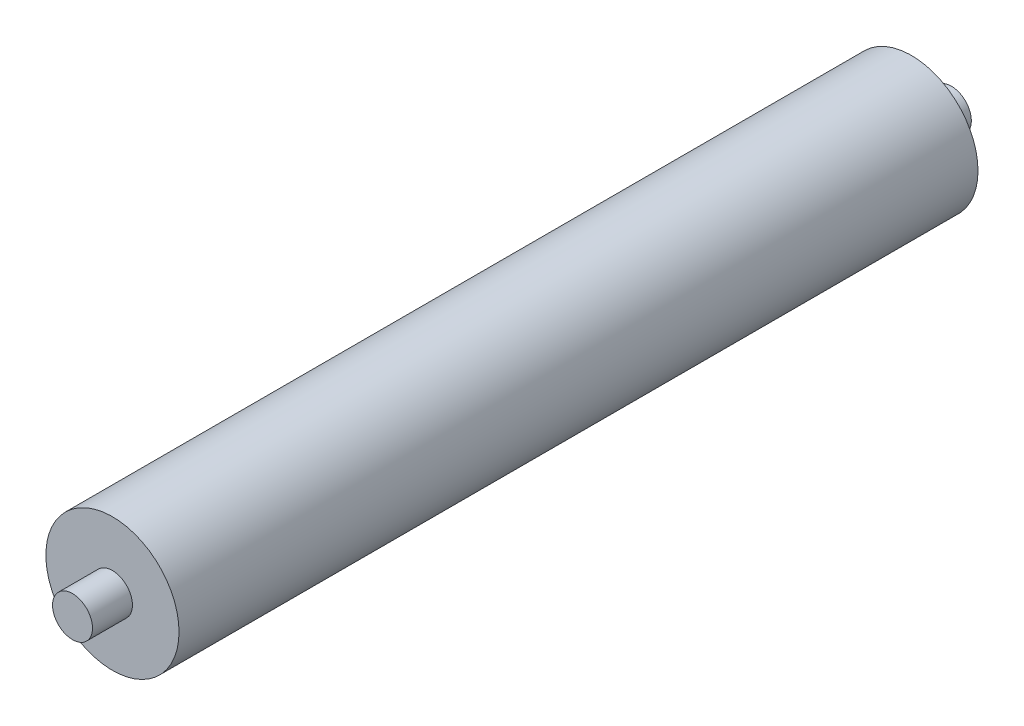
ISO-10303-21;
HEADER;
FILE_DESCRIPTION(('STEP AP214'),'2;1');
FILE_NAME('part.step','',(''),(''),'','','');
FILE_SCHEMA(('AUTOMOTIVE_DESIGN { 1 0 10303 214 1 1 1 1 }'));
ENDSEC;
DATA;
#1=APPLICATION_CONTEXT('core data for automotive mechanical design processes');
#2=APPLICATION_PROTOCOL_DEFINITION('international standard','automotive_design',2000,#1);
#3=PRODUCT_CONTEXT('',#1,'mechanical');
#4=PRODUCT('Part','Part','',(#3));
#5=PRODUCT_RELATED_PRODUCT_CATEGORY('part','',(#4));
#6=PRODUCT_DEFINITION_FORMATION('','',#4);
#7=PRODUCT_DEFINITION_CONTEXT('part definition',#1,'design');
#8=PRODUCT_DEFINITION('design','',#6,#7);
#9=PRODUCT_DEFINITION_SHAPE('','',#8);
#10=(LENGTH_UNIT() NAMED_UNIT(*) SI_UNIT(.MILLI.,.METRE.));
#11=(NAMED_UNIT(*) PLANE_ANGLE_UNIT() SI_UNIT($,.RADIAN.));
#12=(NAMED_UNIT(*) SI_UNIT($,.STERADIAN.) SOLID_ANGLE_UNIT());
#13=UNCERTAINTY_MEASURE_WITH_UNIT(LENGTH_MEASURE(1.E-05),#10,'distance_accuracy_value','');
#14=(GEOMETRIC_REPRESENTATION_CONTEXT(3) GLOBAL_UNCERTAINTY_ASSIGNED_CONTEXT((#13)) GLOBAL_UNIT_ASSIGNED_CONTEXT((#10,
#11,#12)) REPRESENTATION_CONTEXT('',''));
#15=CARTESIAN_POINT('',(0.,0.,0.));
#16=DIRECTION('',(0.,0.,1.));
#17=DIRECTION('',(1.,0.,0.));
#18=AXIS2_PLACEMENT_3D('',#15,#16,#17);
#19=CARTESIAN_POINT('',(0.,0.,150.));
#20=DIRECTION('',(0.,0.,-1.));
#21=DIRECTION('',(-1.,0.,0.));
#22=AXIS2_PLACEMENT_3D('',#19,#20,#21);
#23=CYLINDRICAL_SURFACE('',#22,25.);
#24=CARTESIAN_POINT('',(0.,0.,150.));
#25=DIRECTION('',(0.,0.,1.));
#26=DIRECTION('',(1.,0.,0.));
#27=AXIS2_PLACEMENT_3D('',#24,#25,#26);
#28=CIRCLE('',#27,25.);
#29=CARTESIAN_POINT('',(25.,0.,150.));
#30=VERTEX_POINT('',#29);
#31=EDGE_CURVE('E57',#30,#30,#28,.T.);
#32=ORIENTED_EDGE('',*,*,#31,.F.);
#33=EDGE_LOOP('',(#32));
#34=FACE_BOUND('',#33,.T.);
#35=CARTESIAN_POINT('',(0.,0.,-150.));
#36=DIRECTION('',(0.,0.,1.));
#37=DIRECTION('',(1.,0.,0.));
#38=AXIS2_PLACEMENT_3D('',#35,#36,#37);
#39=CIRCLE('',#38,25.);
#40=CARTESIAN_POINT('',(25.,0.,-150.));
#41=VERTEX_POINT('',#40);
#42=EDGE_CURVE('E60',#41,#41,#39,.T.);
#43=ORIENTED_EDGE('',*,*,#42,.T.);
#44=EDGE_LOOP('',(#43));
#45=FACE_BOUND('',#44,.T.);
#46=ADVANCED_FACE('F39',(#34,#45),#23,.T.);
#47=CARTESIAN_POINT('',(0.,0.,150.));
#48=DIRECTION('',(0.,0.,1.));
#49=DIRECTION('',(1.,0.,0.));
#50=AXIS2_PLACEMENT_3D('',#47,#48,#49);
#51=PLANE('',#50);
#52=CARTESIAN_POINT('',(0.,0.,150.));
#53=DIRECTION('',(0.,0.,1.));
#54=DIRECTION('',(1.,0.,0.));
#55=AXIS2_PLACEMENT_3D('',#52,#53,#54);
#56=CIRCLE('',#55,7.5);
#57=CARTESIAN_POINT('',(7.5,0.,150.));
#58=VERTEX_POINT('',#57);
#59=EDGE_CURVE('E10',#58,#58,#56,.T.);
#60=ORIENTED_EDGE('',*,*,#59,.F.);
#61=EDGE_LOOP('',(#60));
#62=FACE_BOUND('',#61,.T.);
#63=ORIENTED_EDGE('',*,*,#31,.T.);
#64=EDGE_LOOP('',(#63));
#65=FACE_BOUND('',#64,.T.);
#66=ADVANCED_FACE('F93',(#62,#65),#51,.T.);
#67=CARTESIAN_POINT('',(0.,0.,-150.));
#68=DIRECTION('',(0.,0.,1.));
#69=DIRECTION('',(1.,0.,0.));
#70=AXIS2_PLACEMENT_3D('',#67,#68,#69);
#71=PLANE('',#70);
#72=CARTESIAN_POINT('',(0.,0.,-150.));
#73=DIRECTION('',(0.,0.,1.));
#74=DIRECTION('',(1.,0.,0.));
#75=AXIS2_PLACEMENT_3D('',#72,#73,#74);
#76=CIRCLE('',#75,7.5);
#77=CARTESIAN_POINT('',(7.5,0.,-150.));
#78=VERTEX_POINT('',#77);
#79=EDGE_CURVE('E69',#78,#78,#76,.T.);
#80=ORIENTED_EDGE('',*,*,#79,.T.);
#81=EDGE_LOOP('',(#80));
#82=FACE_BOUND('',#81,.T.);
#83=ORIENTED_EDGE('',*,*,#42,.F.);
#84=EDGE_LOOP('',(#83));
#85=FACE_BOUND('',#84,.T.);
#86=ADVANCED_FACE('F76',(#82,#85),#71,.F.);
#87=CARTESIAN_POINT('',(0.,0.,165.));
#88=DIRECTION('',(0.,0.,-1.));
#89=DIRECTION('',(-1.,0.,0.));
#90=AXIS2_PLACEMENT_3D('',#87,#88,#89);
#91=CYLINDRICAL_SURFACE('',#90,7.5);
#92=CARTESIAN_POINT('',(0.,0.,165.));
#93=DIRECTION('',(0.,0.,1.));
#94=DIRECTION('',(1.,0.,0.));
#95=AXIS2_PLACEMENT_3D('',#92,#93,#94);
#96=CIRCLE('',#95,7.5);
#97=CARTESIAN_POINT('',(7.5,0.,165.));
#98=VERTEX_POINT('',#97);
#99=EDGE_CURVE('E55',#98,#98,#96,.T.);
#100=ORIENTED_EDGE('',*,*,#99,.F.);
#101=EDGE_LOOP('',(#100));
#102=FACE_BOUND('',#101,.T.);
#103=ORIENTED_EDGE('',*,*,#59,.T.);
#104=EDGE_LOOP('',(#103));
#105=FACE_BOUND('',#104,.T.);
#106=ADVANCED_FACE('F90',(#102,#105),#91,.T.);
#107=CARTESIAN_POINT('',(0.,0.,165.));
#108=DIRECTION('',(0.,0.,1.));
#109=DIRECTION('',(1.,0.,0.));
#110=AXIS2_PLACEMENT_3D('',#107,#108,#109);
#111=PLANE('',#110);
#112=ORIENTED_EDGE('',*,*,#99,.T.);
#113=EDGE_LOOP('',(#112));
#114=FACE_BOUND('',#113,.T.);
#115=ADVANCED_FACE('F82',(#114),#111,.T.);
#116=CARTESIAN_POINT('',(0.,0.,-165.));
#117=DIRECTION('',(0.,0.,1.));
#118=DIRECTION('',(1.,0.,0.));
#119=AXIS2_PLACEMENT_3D('',#116,#117,#118);
#120=CYLINDRICAL_SURFACE('',#119,7.5);
#121=CARTESIAN_POINT('',(0.,0.,-165.));
#122=DIRECTION('',(0.,0.,1.));
#123=DIRECTION('',(1.,0.,0.));
#124=AXIS2_PLACEMENT_3D('',#121,#122,#123);
#125=CIRCLE('',#124,7.5);
#126=CARTESIAN_POINT('',(7.5,0.,-165.));
#127=VERTEX_POINT('',#126);
#128=EDGE_CURVE('E65',#127,#127,#125,.T.);
#129=ORIENTED_EDGE('',*,*,#128,.T.);
#130=EDGE_LOOP('',(#129));
#131=FACE_BOUND('',#130,.T.);
#132=ORIENTED_EDGE('',*,*,#79,.F.);
#133=EDGE_LOOP('',(#132));
#134=FACE_BOUND('',#133,.T.);
#135=ADVANCED_FACE('F79',(#131,#134),#120,.T.);
#136=CARTESIAN_POINT('',(0.,0.,-165.));
#137=DIRECTION('',(0.,0.,-1.));
#138=DIRECTION('',(1.,0.,0.));
#139=AXIS2_PLACEMENT_3D('',#136,#137,#138);
#140=PLANE('',#139);
#141=ORIENTED_EDGE('',*,*,#128,.F.);
#142=EDGE_LOOP('',(#141));
#143=FACE_BOUND('',#142,.T.);
#144=ADVANCED_FACE('F81',(#143),#140,.T.);
#145=CLOSED_SHELL('',(#46,#66,#86,#106,#115,#135,#144));
#146=CARTESIAN_POINT('',(0.,0.,150.));
#147=DIRECTION('',(0.,0.,-1.));
#148=DIRECTION('',(-1.,0.,0.));
#149=AXIS2_PLACEMENT_3D('',#146,#147,#148);
#150=CYLINDRICAL_SURFACE('',#149,20.);
#151=CARTESIAN_POINT('',(0.,0.,145.));
#152=DIRECTION('',(0.,0.,1.));
#153=DIRECTION('',(1.,0.,0.));
#154=AXIS2_PLACEMENT_3D('',#151,#152,#153);
#155=CIRCLE('',#154,20.);
#156=CARTESIAN_POINT('',(20.,0.,145.));
#157=VERTEX_POINT('',#156);
#158=EDGE_CURVE('E48',#157,#157,#155,.T.);
#159=ORIENTED_EDGE('',*,*,#158,.T.);
#160=EDGE_LOOP('',(#159));
#161=FACE_BOUND('',#160,.T.);
#162=CARTESIAN_POINT('',(0.,0.,-145.));
#163=DIRECTION('',(0.,0.,1.));
#164=DIRECTION('',(1.,0.,0.));
#165=AXIS2_PLACEMENT_3D('',#162,#163,#164);
#166=CIRCLE('',#165,20.);
#167=CARTESIAN_POINT('',(20.,0.,-145.));
#168=VERTEX_POINT('',#167);
#169=EDGE_CURVE('E43',#168,#168,#166,.T.);
#170=ORIENTED_EDGE('',*,*,#169,.F.);
#171=EDGE_LOOP('',(#170));
#172=FACE_BOUND('',#171,.T.);
#173=ADVANCED_FACE('F104',(#161,#172),#150,.F.);
#174=CARTESIAN_POINT('',(0.,0.,145.));
#175=DIRECTION('',(0.,0.,1.));
#176=DIRECTION('',(1.,0.,0.));
#177=AXIS2_PLACEMENT_3D('',#174,#175,#176);
#178=PLANE('',#177);
#179=ORIENTED_EDGE('',*,*,#158,.F.);
#180=EDGE_LOOP('',(#179));
#181=FACE_BOUND('',#180,.T.);
#182=ADVANCED_FACE('F106',(#181),#178,.F.);
#183=CARTESIAN_POINT('',(0.,0.,-145.));
#184=DIRECTION('',(0.,0.,1.));
#185=DIRECTION('',(1.,0.,0.));
#186=AXIS2_PLACEMENT_3D('',#183,#184,#185);
#187=PLANE('',#186);
#188=ORIENTED_EDGE('',*,*,#169,.T.);
#189=EDGE_LOOP('',(#188));
#190=FACE_BOUND('',#189,.T.);
#191=ADVANCED_FACE('F41',(#190),#187,.T.);
#192=CLOSED_SHELL('',(#173,#182,#191));
#193=ORIENTED_CLOSED_SHELL('',*,#192,.T.);
#194=BREP_WITH_VOIDS('B2',#145,(#193));
#195=ADVANCED_BREP_SHAPE_REPRESENTATION('',(#18,#194),#14);
#196=SHAPE_DEFINITION_REPRESENTATION(#9,#195);
ENDSEC;
END-ISO-10303-21;
